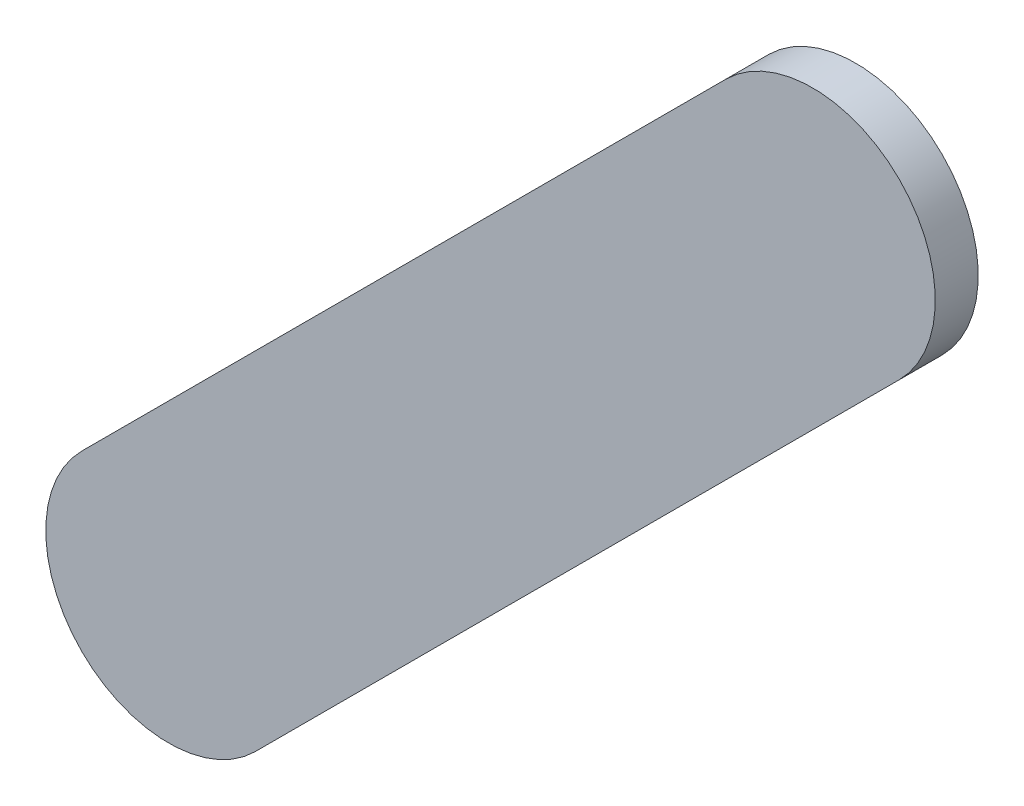
ISO-10303-21;
HEADER;
FILE_DESCRIPTION(('STEP AP214'),'2;1');
FILE_NAME('part.step','',(''),(''),'','','');
FILE_SCHEMA(('AUTOMOTIVE_DESIGN { 1 0 10303 214 1 1 1 1 }'));
ENDSEC;
DATA;
#1=APPLICATION_CONTEXT('core data for automotive mechanical design processes');
#2=APPLICATION_PROTOCOL_DEFINITION('international standard','automotive_design',2000,#1);
#3=PRODUCT_CONTEXT('',#1,'mechanical');
#4=PRODUCT('Part','Part','',(#3));
#5=PRODUCT_RELATED_PRODUCT_CATEGORY('part','',(#4));
#6=PRODUCT_DEFINITION_FORMATION('','',#4);
#7=PRODUCT_DEFINITION_CONTEXT('part definition',#1,'design');
#8=PRODUCT_DEFINITION('design','',#6,#7);
#9=PRODUCT_DEFINITION_SHAPE('','',#8);
#10=(LENGTH_UNIT() NAMED_UNIT(*) SI_UNIT(.MILLI.,.METRE.));
#11=(NAMED_UNIT(*) PLANE_ANGLE_UNIT() SI_UNIT($,.RADIAN.));
#12=(NAMED_UNIT(*) SI_UNIT($,.STERADIAN.) SOLID_ANGLE_UNIT());
#13=UNCERTAINTY_MEASURE_WITH_UNIT(LENGTH_MEASURE(1.E-05),#10,'distance_accuracy_value','');
#14=(GEOMETRIC_REPRESENTATION_CONTEXT(3) GLOBAL_UNCERTAINTY_ASSIGNED_CONTEXT((#13)) GLOBAL_UNIT_ASSIGNED_CONTEXT((#10,
#11,#12)) REPRESENTATION_CONTEXT('',''));
#15=CARTESIAN_POINT('',(0.,0.,0.));
#16=DIRECTION('',(0.,0.,1.));
#17=DIRECTION('',(1.,0.,0.));
#18=AXIS2_PLACEMENT_3D('',#15,#16,#17);
#19=CARTESIAN_POINT('',(92.74571,-116.49571,1.635));
#20=DIRECTION('',(0.,0.,1.));
#21=DIRECTION('',(1.,0.,0.));
#22=AXIS2_PLACEMENT_3D('',#19,#20,#21);
#23=PLANE('',#22);
#24=DIRECTION('',(0.707106781186548,0.707106781186548,0.));
#25=VECTOR('',#24,1.);
#26=CARTESIAN_POINT('',(92.74571,-116.49571,1.635));
#27=LINE('',#26,#25);
#28=CARTESIAN_POINT('',(92.74571,-116.49571,1.635));
#29=VERTEX_POINT('',#28);
#30=CARTESIAN_POINT('',(93.27071,-115.97071,1.635));
#31=VERTEX_POINT('',#30);
#32=EDGE_CURVE('E82',#29,#31,#27,.T.);
#33=ORIENTED_EDGE('',*,*,#32,.T.);
#34=CARTESIAN_POINT('',(93.1999995,-115.8999995,1.635));
#35=DIRECTION('',(0.,0.,1.));
#36=DIRECTION('',(0.707106781187048,-0.707106781186048,0.));
#37=AXIS2_PLACEMENT_3D('',#34,#35,#36);
#38=CIRCLE('',#37,0.09999974810218);
#39=CARTESIAN_POINT('',(93.129289,-115.829289,1.635));
#40=VERTEX_POINT('',#39);
#41=EDGE_CURVE('E106',#31,#40,#38,.T.);
#42=ORIENTED_EDGE('',*,*,#41,.T.);
#43=DIRECTION('',(-0.707106781186548,-0.707106781186548,0.));
#44=VECTOR('',#43,1.);
#45=CARTESIAN_POINT('',(93.129289,-115.829289,1.635));
#46=LINE('',#45,#44);
#47=CARTESIAN_POINT('',(92.604289,-116.354289,1.635));
#48=VERTEX_POINT('',#47);
#49=EDGE_CURVE('E75',#40,#48,#46,.T.);
#50=ORIENTED_EDGE('',*,*,#49,.T.);
#51=CARTESIAN_POINT('',(92.6749995,-116.4249995,1.635));
#52=DIRECTION('',(0.,0.,1.));
#53=DIRECTION('',(-0.707106781186548,0.707106781186548,0.));
#54=AXIS2_PLACEMENT_3D('',#51,#52,#53);
#55=CIRCLE('',#54,0.09999974810219);
#56=EDGE_CURVE('E11',#48,#29,#55,.T.);
#57=ORIENTED_EDGE('',*,*,#56,.T.);
#58=EDGE_LOOP('',(#33,#42,#50,#57));
#59=FACE_BOUND('',#58,.T.);
#60=ADVANCED_FACE('F17',(#59),#23,.T.);
#61=CARTESIAN_POINT('',(92.74571,-116.49571,1.6));
#62=DIRECTION('',(0.,0.,1.));
#63=DIRECTION('',(1.,0.,0.));
#64=AXIS2_PLACEMENT_3D('',#61,#62,#63);
#65=PLANE('',#64);
#66=CARTESIAN_POINT('',(92.6749995,-116.4249995,1.6));
#67=DIRECTION('',(0.,0.,1.));
#68=DIRECTION('',(-0.707106781186548,0.707106781186548,0.));
#69=AXIS2_PLACEMENT_3D('',#66,#67,#68);
#70=CIRCLE('',#69,0.09999974810219);
#71=CARTESIAN_POINT('',(92.604289,-116.354289,1.6));
#72=VERTEX_POINT('',#71);
#73=CARTESIAN_POINT('',(92.74571,-116.49571,1.6));
#74=VERTEX_POINT('',#73);
#75=EDGE_CURVE('E20',#72,#74,#70,.T.);
#76=ORIENTED_EDGE('',*,*,#75,.F.);
#77=DIRECTION('',(-0.707106781186548,-0.707106781186548,0.));
#78=VECTOR('',#77,1.);
#79=CARTESIAN_POINT('',(93.129289,-115.829289,1.6));
#80=LINE('',#79,#78);
#81=CARTESIAN_POINT('',(93.129289,-115.829289,1.6));
#82=VERTEX_POINT('',#81);
#83=EDGE_CURVE('E99',#82,#72,#80,.T.);
#84=ORIENTED_EDGE('',*,*,#83,.F.);
#85=CARTESIAN_POINT('',(93.1999995,-115.8999995,1.6));
#86=DIRECTION('',(0.,0.,1.));
#87=DIRECTION('',(0.707106781187048,-0.707106781186048,0.));
#88=AXIS2_PLACEMENT_3D('',#85,#86,#87);
#89=CIRCLE('',#88,0.09999974810218);
#90=CARTESIAN_POINT('',(93.27071,-115.97071,1.6));
#91=VERTEX_POINT('',#90);
#92=EDGE_CURVE('E84',#91,#82,#89,.T.);
#93=ORIENTED_EDGE('',*,*,#92,.F.);
#94=DIRECTION('',(0.707106781186548,0.707106781186548,0.));
#95=VECTOR('',#94,1.);
#96=CARTESIAN_POINT('',(92.74571,-116.49571,1.6));
#97=LINE('',#96,#95);
#98=EDGE_CURVE('E80',#74,#91,#97,.T.);
#99=ORIENTED_EDGE('',*,*,#98,.F.);
#100=EDGE_LOOP('',(#76,#84,#93,#99));
#101=FACE_BOUND('',#100,.T.);
#102=ADVANCED_FACE('F86',(#101),#65,.F.);
#103=CARTESIAN_POINT('',(92.6749995,-116.4249995,1.6));
#104=DIRECTION('',(0.,0.,-1.));
#105=DIRECTION('',(-0.707106781186548,0.707106781186548,0.));
#106=AXIS2_PLACEMENT_3D('',#103,#104,#105);
#107=CYLINDRICAL_SURFACE('',#106,0.09999974810219);
#108=ORIENTED_EDGE('',*,*,#75,.T.);
#109=DIRECTION('',(0.,0.,1.));
#110=VECTOR('',#109,1.);
#111=CARTESIAN_POINT('',(92.74571,-116.49571,1.6));
#112=LINE('',#111,#110);
#113=EDGE_CURVE('E69',#74,#29,#112,.T.);
#114=ORIENTED_EDGE('',*,*,#113,.T.);
#115=ORIENTED_EDGE('',*,*,#56,.F.);
#116=DIRECTION('',(0.,0.,1.));
#117=VECTOR('',#116,1.);
#118=CARTESIAN_POINT('',(92.604289,-116.354289,1.6));
#119=LINE('',#118,#117);
#120=EDGE_CURVE('E72',#72,#48,#119,.T.);
#121=ORIENTED_EDGE('',*,*,#120,.F.);
#122=EDGE_LOOP('',(#108,#114,#115,#121));
#123=FACE_BOUND('',#122,.T.);
#124=ADVANCED_FACE('F68',(#123),#107,.T.);
#125=CARTESIAN_POINT('',(93.129289,-115.829289,1.6));
#126=DIRECTION('',(0.707106781186548,-0.707106781186548,0.));
#127=DIRECTION('',(0.,0.,-1.));
#128=AXIS2_PLACEMENT_3D('',#125,#126,#127);
#129=PLANE('',#128);
#130=ORIENTED_EDGE('',*,*,#83,.T.);
#131=ORIENTED_EDGE('',*,*,#120,.T.);
#132=ORIENTED_EDGE('',*,*,#49,.F.);
#133=DIRECTION('',(0.,0.,1.));
#134=VECTOR('',#133,1.);
#135=CARTESIAN_POINT('',(93.129289,-115.829289,1.6));
#136=LINE('',#135,#134);
#137=EDGE_CURVE('E102',#82,#40,#136,.T.);
#138=ORIENTED_EDGE('',*,*,#137,.F.);
#139=EDGE_LOOP('',(#130,#131,#132,#138));
#140=FACE_BOUND('',#139,.T.);
#141=ADVANCED_FACE('F119',(#140),#129,.F.);
#142=CARTESIAN_POINT('',(93.1999995,-115.8999995,1.6));
#143=DIRECTION('',(0.,0.,-1.));
#144=DIRECTION('',(0.707106781187048,-0.707106781186048,0.));
#145=AXIS2_PLACEMENT_3D('',#142,#143,#144);
#146=CYLINDRICAL_SURFACE('',#145,0.09999974810218);
#147=ORIENTED_EDGE('',*,*,#92,.T.);
#148=ORIENTED_EDGE('',*,*,#137,.T.);
#149=ORIENTED_EDGE('',*,*,#41,.F.);
#150=DIRECTION('',(0.,0.,1.));
#151=VECTOR('',#150,1.);
#152=CARTESIAN_POINT('',(93.27071,-115.97071,1.6));
#153=LINE('',#152,#151);
#154=EDGE_CURVE('E90',#91,#31,#153,.T.);
#155=ORIENTED_EDGE('',*,*,#154,.F.);
#156=EDGE_LOOP('',(#147,#148,#149,#155));
#157=FACE_BOUND('',#156,.T.);
#158=ADVANCED_FACE('F161',(#157),#146,.T.);
#159=CARTESIAN_POINT('',(92.74571,-116.49571,1.6));
#160=DIRECTION('',(-0.707106781186548,0.707106781186548,0.));
#161=DIRECTION('',(0.,0.,1.));
#162=AXIS2_PLACEMENT_3D('',#159,#160,#161);
#163=PLANE('',#162);
#164=ORIENTED_EDGE('',*,*,#98,.T.);
#165=ORIENTED_EDGE('',*,*,#154,.T.);
#166=ORIENTED_EDGE('',*,*,#32,.F.);
#167=ORIENTED_EDGE('',*,*,#113,.F.);
#168=EDGE_LOOP('',(#164,#165,#166,#167));
#169=FACE_BOUND('',#168,.T.);
#170=ADVANCED_FACE('F78',(#169),#163,.F.);
#171=CLOSED_SHELL('',(#60,#102,#124,#141,#158,#170));
#172=MANIFOLD_SOLID_BREP('B1',#171);
#173=ADVANCED_BREP_SHAPE_REPRESENTATION('',(#18,#172),#14);
#174=SHAPE_DEFINITION_REPRESENTATION(#9,#173);
ENDSEC;
END-ISO-10303-21;
